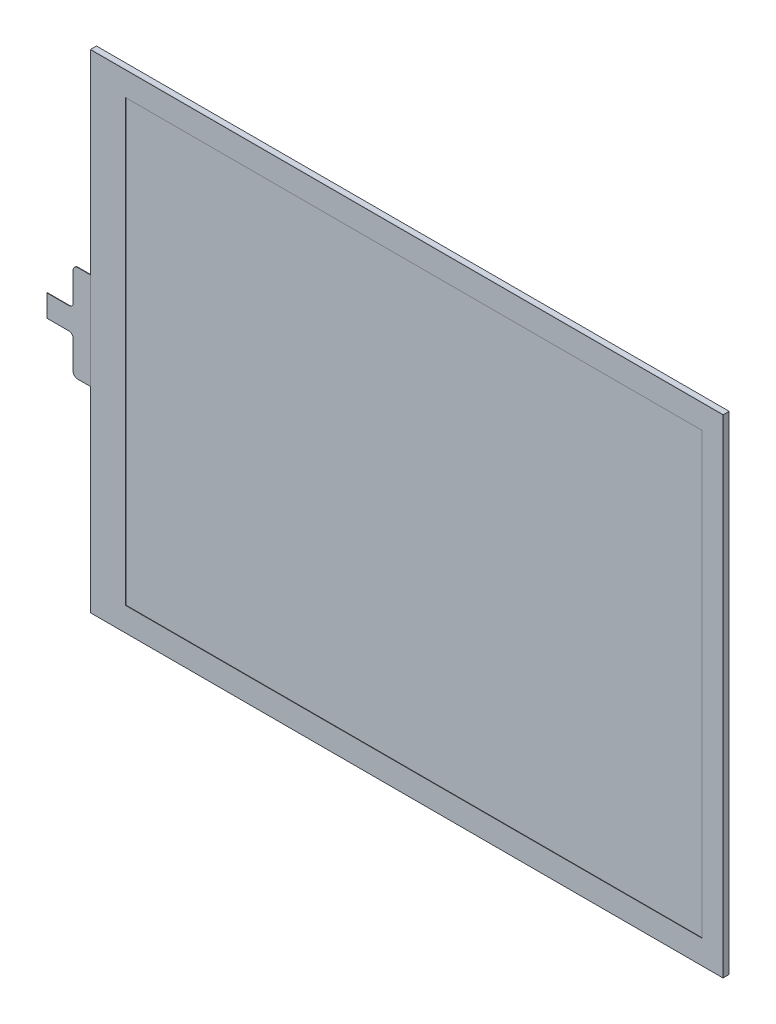
ISO-10303-21;
HEADER;
FILE_DESCRIPTION(('STEP AP214'),'2;1');
FILE_NAME('part.step','',(''),(''),'','','');
FILE_SCHEMA(('AUTOMOTIVE_DESIGN { 1 0 10303 214 1 1 1 1 }'));
ENDSEC;
DATA;
#1=APPLICATION_CONTEXT('core data for automotive mechanical design processes');
#2=APPLICATION_PROTOCOL_DEFINITION('international standard','automotive_design',2000,#1);
#3=PRODUCT_CONTEXT('',#1,'mechanical');
#4=PRODUCT('Part','Part','',(#3));
#5=PRODUCT_RELATED_PRODUCT_CATEGORY('part','',(#4));
#6=PRODUCT_DEFINITION_FORMATION('','',#4);
#7=PRODUCT_DEFINITION_CONTEXT('part definition',#1,'design');
#8=PRODUCT_DEFINITION('design','',#6,#7);
#9=PRODUCT_DEFINITION_SHAPE('','',#8);
#10=(LENGTH_UNIT() NAMED_UNIT(*) SI_UNIT(.MILLI.,.METRE.));
#11=(NAMED_UNIT(*) PLANE_ANGLE_UNIT() SI_UNIT($,.RADIAN.));
#12=(NAMED_UNIT(*) SI_UNIT($,.STERADIAN.) SOLID_ANGLE_UNIT());
#13=UNCERTAINTY_MEASURE_WITH_UNIT(LENGTH_MEASURE(1.E-05),#10,'distance_accuracy_value','');
#14=(GEOMETRIC_REPRESENTATION_CONTEXT(3) GLOBAL_UNCERTAINTY_ASSIGNED_CONTEXT((#13)) GLOBAL_UNIT_ASSIGNED_CONTEXT((#10,
#11,#12)) REPRESENTATION_CONTEXT('',''));
#15=CARTESIAN_POINT('',(0.,0.,0.));
#16=DIRECTION('',(0.,0.,1.));
#17=DIRECTION('',(1.,0.,0.));
#18=AXIS2_PLACEMENT_3D('',#15,#16,#17);
#19=CARTESIAN_POINT('',(144.,111.,1.4));
#20=DIRECTION('',(0.,0.,1.));
#21=DIRECTION('',(1.,0.,0.));
#22=AXIS2_PLACEMENT_3D('',#19,#20,#21);
#23=PLANE('',#22);
#24=DIRECTION('',(0.,1.,0.));
#25=VECTOR('',#24,1.);
#26=CARTESIAN_POINT('',(144.,0.,1.4));
#27=LINE('',#26,#25);
#28=CARTESIAN_POINT('',(144.,0.,1.4));
#29=VERTEX_POINT('',#28);
#30=CARTESIAN_POINT('',(144.,111.,1.4));
#31=VERTEX_POINT('',#30);
#32=EDGE_CURVE('E144',#29,#31,#27,.T.);
#33=ORIENTED_EDGE('',*,*,#32,.T.);
#34=DIRECTION('',(-1.,0.,0.));
#35=VECTOR('',#34,1.);
#36=CARTESIAN_POINT('',(144.,111.,1.4));
#37=LINE('',#36,#35);
#38=CARTESIAN_POINT('',(0.,111.,1.4));
#39=VERTEX_POINT('',#38);
#40=EDGE_CURVE('E147',#31,#39,#37,.T.);
#41=ORIENTED_EDGE('',*,*,#40,.T.);
#42=DIRECTION('',(0.,-1.,0.));
#43=VECTOR('',#42,1.);
#44=CARTESIAN_POINT('',(0.,111.,1.4));
#45=LINE('',#44,#43);
#46=CARTESIAN_POINT('',(0.,0.,1.4));
#47=VERTEX_POINT('',#46);
#48=EDGE_CURVE('E150',#39,#47,#45,.T.);
#49=ORIENTED_EDGE('',*,*,#48,.T.);
#50=DIRECTION('',(1.,0.,0.));
#51=VECTOR('',#50,1.);
#52=CARTESIAN_POINT('',(0.,0.,1.4));
#53=LINE('',#52,#51);
#54=EDGE_CURVE('E152',#47,#29,#53,.T.);
#55=ORIENTED_EDGE('',*,*,#54,.T.);
#56=EDGE_LOOP('',(#33,#41,#49,#55));
#57=FACE_BOUND('',#56,.T.);
#58=DIRECTION('',(-1.,0.,0.));
#59=VECTOR('',#58,1.);
#60=CARTESIAN_POINT('',(139.2,105.55,1.4));
#61=LINE('',#60,#59);
#62=CARTESIAN_POINT('',(139.2,105.55,1.4));
#63=VERTEX_POINT('',#62);
#64=CARTESIAN_POINT('',(8.00000000000001,105.55,1.4));
#65=VERTEX_POINT('',#64);
#66=EDGE_CURVE('E116',#63,#65,#61,.T.);
#67=ORIENTED_EDGE('',*,*,#66,.F.);
#68=DIRECTION('',(0.,1.,0.));
#69=VECTOR('',#68,1.);
#70=CARTESIAN_POINT('',(139.2,5.45000000000001,1.4));
#71=LINE('',#70,#69);
#72=CARTESIAN_POINT('',(139.2,5.45000000000001,1.4));
#73=VERTEX_POINT('',#72);
#74=EDGE_CURVE('E108',#73,#63,#71,.T.);
#75=ORIENTED_EDGE('',*,*,#74,.F.);
#76=DIRECTION('',(1.,0.,0.));
#77=VECTOR('',#76,1.);
#78=CARTESIAN_POINT('',(8.00000000000001,5.45,1.4));
#79=LINE('',#78,#77);
#80=CARTESIAN_POINT('',(8.00000000000001,5.45,1.4));
#81=VERTEX_POINT('',#80);
#82=EDGE_CURVE('E130',#81,#73,#79,.T.);
#83=ORIENTED_EDGE('',*,*,#82,.F.);
#84=DIRECTION('',(0.,-1.,0.));
#85=VECTOR('',#84,1.);
#86=CARTESIAN_POINT('',(8.00000000000001,105.55,1.4));
#87=LINE('',#86,#85);
#88=EDGE_CURVE('E128',#65,#81,#87,.T.);
#89=ORIENTED_EDGE('',*,*,#88,.F.);
#90=EDGE_LOOP('',(#67,#75,#83,#89));
#91=FACE_BOUND('',#90,.T.);
#92=ADVANCED_FACE('F43',(#57,#91),#23,.T.);
#93=CARTESIAN_POINT('',(144.,111.,1.3));
#94=DIRECTION('',(0.,0.,1.));
#95=DIRECTION('',(1.,0.,0.));
#96=AXIS2_PLACEMENT_3D('',#93,#94,#95);
#97=PLANE('',#96);
#98=DIRECTION('',(0.,1.,0.));
#99=VECTOR('',#98,1.);
#100=CARTESIAN_POINT('',(144.,0.,1.3));
#101=LINE('',#100,#99);
#102=CARTESIAN_POINT('',(144.,0.,1.3));
#103=VERTEX_POINT('',#102);
#104=CARTESIAN_POINT('',(144.,111.,1.3));
#105=VERTEX_POINT('',#104);
#106=EDGE_CURVE('E124',#103,#105,#101,.T.);
#107=ORIENTED_EDGE('',*,*,#106,.F.);
#108=DIRECTION('',(1.,0.,0.));
#109=VECTOR('',#108,1.);
#110=CARTESIAN_POINT('',(0.,0.,1.3));
#111=LINE('',#110,#109);
#112=CARTESIAN_POINT('',(0.,0.,1.3));
#113=VERTEX_POINT('',#112);
#114=EDGE_CURVE('E148',#113,#103,#111,.T.);
#115=ORIENTED_EDGE('',*,*,#114,.F.);
#116=DIRECTION('',(0.,-1.,0.));
#117=VECTOR('',#116,1.);
#118=CARTESIAN_POINT('',(0.,44.5,1.3));
#119=LINE('',#118,#117);
#120=CARTESIAN_POINT('',(0.,111.,1.3));
#121=VERTEX_POINT('',#120);
#122=EDGE_CURVE('E160',#121,#113,#119,.T.);
#123=ORIENTED_EDGE('',*,*,#122,.F.);
#124=DIRECTION('',(-1.,0.,0.));
#125=VECTOR('',#124,1.);
#126=CARTESIAN_POINT('',(144.,111.,1.3));
#127=LINE('',#126,#125);
#128=EDGE_CURVE('E157',#105,#121,#127,.T.);
#129=ORIENTED_EDGE('',*,*,#128,.F.);
#130=EDGE_LOOP('',(#107,#115,#123,#129));
#131=FACE_BOUND('',#130,.T.);
#132=DIRECTION('',(0.,1.,0.));
#133=VECTOR('',#132,1.);
#134=CARTESIAN_POINT('',(139.2,5.45000000000001,1.3));
#135=LINE('',#134,#133);
#136=CARTESIAN_POINT('',(139.2,5.45000000000001,1.3));
#137=VERTEX_POINT('',#136);
#138=CARTESIAN_POINT('',(139.2,105.55,1.3));
#139=VERTEX_POINT('',#138);
#140=EDGE_CURVE('E66',#137,#139,#135,.T.);
#141=ORIENTED_EDGE('',*,*,#140,.T.);
#142=DIRECTION('',(-1.,0.,0.));
#143=VECTOR('',#142,1.);
#144=CARTESIAN_POINT('',(139.2,105.55,1.3));
#145=LINE('',#144,#143);
#146=CARTESIAN_POINT('',(8.00000000000001,105.55,1.3));
#147=VERTEX_POINT('',#146);
#148=EDGE_CURVE('E123',#139,#147,#145,.T.);
#149=ORIENTED_EDGE('',*,*,#148,.T.);
#150=DIRECTION('',(0.,-1.,0.));
#151=VECTOR('',#150,1.);
#152=CARTESIAN_POINT('',(8.00000000000001,105.55,1.3));
#153=LINE('',#152,#151);
#154=CARTESIAN_POINT('',(8.00000000000001,5.45,1.3));
#155=VERTEX_POINT('',#154);
#156=EDGE_CURVE('E136',#147,#155,#153,.T.);
#157=ORIENTED_EDGE('',*,*,#156,.T.);
#158=DIRECTION('',(1.,0.,0.));
#159=VECTOR('',#158,1.);
#160=CARTESIAN_POINT('',(8.00000000000001,5.45,1.3));
#161=LINE('',#160,#159);
#162=EDGE_CURVE('E117',#155,#137,#161,.T.);
#163=ORIENTED_EDGE('',*,*,#162,.T.);
#164=EDGE_LOOP('',(#141,#149,#157,#163));
#165=FACE_BOUND('',#164,.T.);
#166=ADVANCED_FACE('F178',(#131,#165),#97,.F.);
#167=CARTESIAN_POINT('',(144.,0.,1.4));
#168=DIRECTION('',(-1.,0.,0.));
#169=DIRECTION('',(0.,0.,1.));
#170=AXIS2_PLACEMENT_3D('',#167,#168,#169);
#171=PLANE('',#170);
#172=ORIENTED_EDGE('',*,*,#106,.T.);
#173=DIRECTION('',(0.,0.,-1.));
#174=VECTOR('',#173,1.);
#175=CARTESIAN_POINT('',(144.,111.,1.4));
#176=LINE('',#175,#174);
#177=EDGE_CURVE('E12',#31,#105,#176,.T.);
#178=ORIENTED_EDGE('',*,*,#177,.F.);
#179=ORIENTED_EDGE('',*,*,#32,.F.);
#180=DIRECTION('',(0.,0.,-1.));
#181=VECTOR('',#180,1.);
#182=CARTESIAN_POINT('',(144.,0.,1.4));
#183=LINE('',#182,#181);
#184=EDGE_CURVE('E154',#29,#103,#183,.T.);
#185=ORIENTED_EDGE('',*,*,#184,.T.);
#186=EDGE_LOOP('',(#172,#178,#179,#185));
#187=FACE_BOUND('',#186,.T.);
#188=ADVANCED_FACE('F45',(#187),#171,.F.);
#189=CARTESIAN_POINT('',(144.,111.,1.4));
#190=DIRECTION('',(0.,-1.,0.));
#191=DIRECTION('',(0.,0.,-1.));
#192=AXIS2_PLACEMENT_3D('',#189,#190,#191);
#193=PLANE('',#192);
#194=ORIENTED_EDGE('',*,*,#128,.T.);
#195=DIRECTION('',(0.,0.,-1.));
#196=VECTOR('',#195,1.);
#197=CARTESIAN_POINT('',(0.,111.,1.4));
#198=LINE('',#197,#196);
#199=EDGE_CURVE('E51',#39,#121,#198,.T.);
#200=ORIENTED_EDGE('',*,*,#199,.F.);
#201=ORIENTED_EDGE('',*,*,#40,.F.);
#202=ORIENTED_EDGE('',*,*,#177,.T.);
#203=EDGE_LOOP('',(#194,#200,#201,#202));
#204=FACE_BOUND('',#203,.T.);
#205=ADVANCED_FACE('F174',(#204),#193,.F.);
#206=CARTESIAN_POINT('',(0.,44.5,1.4));
#207=DIRECTION('',(1.,0.,0.));
#208=DIRECTION('',(0.,0.,-1.));
#209=AXIS2_PLACEMENT_3D('',#206,#207,#208);
#210=PLANE('',#209);
#211=ORIENTED_EDGE('',*,*,#122,.T.);
#212=DIRECTION('',(0.,0.,-1.));
#213=VECTOR('',#212,1.);
#214=CARTESIAN_POINT('',(0.,0.,1.4));
#215=LINE('',#214,#213);
#216=EDGE_CURVE('E165',#47,#113,#215,.T.);
#217=ORIENTED_EDGE('',*,*,#216,.F.);
#218=ORIENTED_EDGE('',*,*,#48,.F.);
#219=ORIENTED_EDGE('',*,*,#199,.T.);
#220=EDGE_LOOP('',(#211,#217,#218,#219));
#221=FACE_BOUND('',#220,.T.);
#222=ADVANCED_FACE('F171',(#221),#210,.F.);
#223=CARTESIAN_POINT('',(0.,0.,1.4));
#224=DIRECTION('',(0.,1.,0.));
#225=DIRECTION('',(0.,0.,1.));
#226=AXIS2_PLACEMENT_3D('',#223,#224,#225);
#227=PLANE('',#226);
#228=ORIENTED_EDGE('',*,*,#114,.T.);
#229=ORIENTED_EDGE('',*,*,#184,.F.);
#230=ORIENTED_EDGE('',*,*,#54,.F.);
#231=ORIENTED_EDGE('',*,*,#216,.T.);
#232=EDGE_LOOP('',(#228,#229,#230,#231));
#233=FACE_BOUND('',#232,.T.);
#234=ADVANCED_FACE('F183',(#233),#227,.F.);
#235=CARTESIAN_POINT('',(139.2,5.45000000000001,1.4));
#236=DIRECTION('',(-1.,0.,0.));
#237=DIRECTION('',(0.,0.,1.));
#238=AXIS2_PLACEMENT_3D('',#235,#236,#237);
#239=PLANE('',#238);
#240=ORIENTED_EDGE('',*,*,#140,.F.);
#241=DIRECTION('',(0.,0.,-1.));
#242=VECTOR('',#241,1.);
#243=CARTESIAN_POINT('',(139.2,5.45000000000001,1.4));
#244=LINE('',#243,#242);
#245=EDGE_CURVE('E112',#73,#137,#244,.T.);
#246=ORIENTED_EDGE('',*,*,#245,.F.);
#247=ORIENTED_EDGE('',*,*,#74,.T.);
#248=DIRECTION('',(0.,0.,-1.));
#249=VECTOR('',#248,1.);
#250=CARTESIAN_POINT('',(139.2,105.55,1.4));
#251=LINE('',#250,#249);
#252=EDGE_CURVE('E111',#63,#139,#251,.T.);
#253=ORIENTED_EDGE('',*,*,#252,.T.);
#254=EDGE_LOOP('',(#240,#246,#247,#253));
#255=FACE_BOUND('',#254,.T.);
#256=ADVANCED_FACE('F110',(#255),#239,.T.);
#257=CARTESIAN_POINT('',(139.2,105.55,1.4));
#258=DIRECTION('',(0.,-1.,0.));
#259=DIRECTION('',(1.,0.,0.));
#260=AXIS2_PLACEMENT_3D('',#257,#258,#259);
#261=PLANE('',#260);
#262=ORIENTED_EDGE('',*,*,#148,.F.);
#263=ORIENTED_EDGE('',*,*,#252,.F.);
#264=ORIENTED_EDGE('',*,*,#66,.T.);
#265=DIRECTION('',(0.,0.,-1.));
#266=VECTOR('',#265,1.);
#267=CARTESIAN_POINT('',(8.00000000000001,105.55,1.4));
#268=LINE('',#267,#266);
#269=EDGE_CURVE('E125',#65,#147,#268,.T.);
#270=ORIENTED_EDGE('',*,*,#269,.T.);
#271=EDGE_LOOP('',(#262,#263,#264,#270));
#272=FACE_BOUND('',#271,.T.);
#273=ADVANCED_FACE('F120',(#272),#261,.T.);
#274=CARTESIAN_POINT('',(8.00000000000001,105.55,1.4));
#275=DIRECTION('',(1.,0.,0.));
#276=DIRECTION('',(0.,1.,0.));
#277=AXIS2_PLACEMENT_3D('',#274,#275,#276);
#278=PLANE('',#277);
#279=ORIENTED_EDGE('',*,*,#156,.F.);
#280=ORIENTED_EDGE('',*,*,#269,.F.);
#281=ORIENTED_EDGE('',*,*,#88,.T.);
#282=DIRECTION('',(0.,0.,-1.));
#283=VECTOR('',#282,1.);
#284=CARTESIAN_POINT('',(8.00000000000001,5.45,1.4));
#285=LINE('',#284,#283);
#286=EDGE_CURVE('E58',#81,#155,#285,.T.);
#287=ORIENTED_EDGE('',*,*,#286,.T.);
#288=EDGE_LOOP('',(#279,#280,#281,#287));
#289=FACE_BOUND('',#288,.T.);
#290=ADVANCED_FACE('F252',(#289),#278,.T.);
#291=CARTESIAN_POINT('',(8.00000000000001,5.45,1.4));
#292=DIRECTION('',(0.,1.,0.));
#293=DIRECTION('',(-1.,0.,0.));
#294=AXIS2_PLACEMENT_3D('',#291,#292,#293);
#295=PLANE('',#294);
#296=ORIENTED_EDGE('',*,*,#162,.F.);
#297=ORIENTED_EDGE('',*,*,#286,.F.);
#298=ORIENTED_EDGE('',*,*,#82,.T.);
#299=ORIENTED_EDGE('',*,*,#245,.T.);
#300=EDGE_LOOP('',(#296,#297,#298,#299));
#301=FACE_BOUND('',#300,.T.);
#302=ADVANCED_FACE('F259',(#301),#295,.T.);
#303=CLOSED_SHELL('',(#92,#166,#188,#205,#222,#234,#256,#273,#290,#302));
#304=MANIFOLD_SOLID_BREP('B2',#303);
#305=CARTESIAN_POINT('',(0.,0.,1.3));
#306=DIRECTION('',(1.,0.,0.));
#307=DIRECTION('',(0.,0.,-1.));
#308=AXIS2_PLACEMENT_3D('',#305,#306,#307);
#309=PLANE('',#308);
#310=DIRECTION('',(0.,0.,1.));
#311=VECTOR('',#310,1.);
#312=CARTESIAN_POINT('',(0.,44.5,1.2));
#313=LINE('',#312,#311);
#314=CARTESIAN_POINT('',(0.,44.5,1.2));
#315=VERTEX_POINT('',#314);
#316=CARTESIAN_POINT('',(0.,44.5,1.3));
#317=VERTEX_POINT('',#316);
#318=EDGE_CURVE('E422',#315,#317,#313,.T.);
#319=ORIENTED_EDGE('',*,*,#318,.F.);
#320=DIRECTION('',(0.,1.,0.));
#321=VECTOR('',#320,1.);
#322=CARTESIAN_POINT('',(0.,66.5,1.2));
#323=LINE('',#322,#321);
#324=CARTESIAN_POINT('',(0.,66.5,1.2));
#325=VERTEX_POINT('',#324);
#326=EDGE_CURVE('E415',#315,#325,#323,.T.);
#327=ORIENTED_EDGE('',*,*,#326,.T.);
#328=DIRECTION('',(0.,0.,1.));
#329=VECTOR('',#328,1.);
#330=CARTESIAN_POINT('',(0.,66.5,1.2));
#331=LINE('',#330,#329);
#332=CARTESIAN_POINT('',(0.,66.5,1.3));
#333=VERTEX_POINT('',#332);
#334=EDGE_CURVE('E401',#325,#333,#331,.T.);
#335=ORIENTED_EDGE('',*,*,#334,.T.);
#336=DIRECTION('',(0.,-1.,0.));
#337=VECTOR('',#336,1.);
#338=CARTESIAN_POINT('',(0.,0.,1.3));
#339=LINE('',#338,#337);
#340=CARTESIAN_POINT('',(0.,111.,1.3));
#341=VERTEX_POINT('',#340);
#342=EDGE_CURVE('E529',#341,#333,#339,.T.);
#343=ORIENTED_EDGE('',*,*,#342,.F.);
#344=DIRECTION('',(0.,0.,-1.));
#345=VECTOR('',#344,1.);
#346=CARTESIAN_POINT('',(0.,111.,1.3));
#347=LINE('',#346,#345);
#348=CARTESIAN_POINT('',(0.,111.,0.));
#349=VERTEX_POINT('',#348);
#350=EDGE_CURVE('E523',#341,#349,#347,.T.);
#351=ORIENTED_EDGE('',*,*,#350,.T.);
#352=DIRECTION('',(0.,-1.,0.));
#353=VECTOR('',#352,1.);
#354=CARTESIAN_POINT('',(0.,0.,0.));
#355=LINE('',#354,#353);
#356=CARTESIAN_POINT('',(0.,0.,0.));
#357=VERTEX_POINT('',#356);
#358=EDGE_CURVE('E507',#349,#357,#355,.T.);
#359=ORIENTED_EDGE('',*,*,#358,.T.);
#360=DIRECTION('',(0.,0.,-1.));
#361=VECTOR('',#360,1.);
#362=CARTESIAN_POINT('',(0.,0.,1.3));
#363=LINE('',#362,#361);
#364=CARTESIAN_POINT('',(0.,0.,1.3));
#365=VERTEX_POINT('',#364);
#366=EDGE_CURVE('E41',#365,#357,#363,.T.);
#367=ORIENTED_EDGE('',*,*,#366,.F.);
#368=EDGE_CURVE('E332',#317,#365,#339,.T.);
#369=ORIENTED_EDGE('',*,*,#368,.F.);
#370=EDGE_LOOP('',(#319,#327,#335,#343,#351,#359,#367,#369));
#371=FACE_BOUND('',#370,.T.);
#372=ADVANCED_FACE('F279',(#371),#309,.F.);
#373=CARTESIAN_POINT('',(0.,0.,1.3));
#374=DIRECTION('',(0.,1.,0.));
#375=DIRECTION('',(0.,0.,1.));
#376=AXIS2_PLACEMENT_3D('',#373,#374,#375);
#377=PLANE('',#376);
#378=DIRECTION('',(1.,0.,0.));
#379=VECTOR('',#378,1.);
#380=CARTESIAN_POINT('',(0.,0.,0.));
#381=LINE('',#380,#379);
#382=CARTESIAN_POINT('',(144.,0.,0.));
#383=VERTEX_POINT('',#382);
#384=EDGE_CURVE('E512',#357,#383,#381,.T.);
#385=ORIENTED_EDGE('',*,*,#384,.T.);
#386=DIRECTION('',(0.,0.,-1.));
#387=VECTOR('',#386,1.);
#388=CARTESIAN_POINT('',(144.,0.,1.3));
#389=LINE('',#388,#387);
#390=CARTESIAN_POINT('',(144.,0.,1.3));
#391=VERTEX_POINT('',#390);
#392=EDGE_CURVE('E287',#391,#383,#389,.T.);
#393=ORIENTED_EDGE('',*,*,#392,.F.);
#394=DIRECTION('',(1.,0.,0.));
#395=VECTOR('',#394,1.);
#396=CARTESIAN_POINT('',(0.,0.,1.3));
#397=LINE('',#396,#395);
#398=EDGE_CURVE('E531',#365,#391,#397,.T.);
#399=ORIENTED_EDGE('',*,*,#398,.F.);
#400=ORIENTED_EDGE('',*,*,#366,.T.);
#401=EDGE_LOOP('',(#385,#393,#399,#400));
#402=FACE_BOUND('',#401,.T.);
#403=ADVANCED_FACE('F539',(#402),#377,.F.);
#404=CARTESIAN_POINT('',(144.,0.,1.3));
#405=DIRECTION('',(-1.,0.,0.));
#406=DIRECTION('',(0.,0.,1.));
#407=AXIS2_PLACEMENT_3D('',#404,#405,#406);
#408=PLANE('',#407);
#409=DIRECTION('',(0.,1.,0.));
#410=VECTOR('',#409,1.);
#411=CARTESIAN_POINT('',(144.,0.,0.));
#412=LINE('',#411,#410);
#413=CARTESIAN_POINT('',(144.,111.,0.));
#414=VERTEX_POINT('',#413);
#415=EDGE_CURVE('E516',#383,#414,#412,.T.);
#416=ORIENTED_EDGE('',*,*,#415,.T.);
#417=DIRECTION('',(0.,0.,-1.));
#418=VECTOR('',#417,1.);
#419=CARTESIAN_POINT('',(144.,111.,1.3));
#420=LINE('',#419,#418);
#421=CARTESIAN_POINT('',(144.,111.,1.3));
#422=VERTEX_POINT('',#421);
#423=EDGE_CURVE('E525',#422,#414,#420,.T.);
#424=ORIENTED_EDGE('',*,*,#423,.F.);
#425=DIRECTION('',(0.,1.,0.));
#426=VECTOR('',#425,1.);
#427=CARTESIAN_POINT('',(144.,0.,1.3));
#428=LINE('',#427,#426);
#429=EDGE_CURVE('E541',#391,#422,#428,.T.);
#430=ORIENTED_EDGE('',*,*,#429,.F.);
#431=ORIENTED_EDGE('',*,*,#392,.T.);
#432=EDGE_LOOP('',(#416,#424,#430,#431));
#433=FACE_BOUND('',#432,.T.);
#434=ADVANCED_FACE('F544',(#433),#408,.F.);
#435=CARTESIAN_POINT('',(0.,111.,1.3));
#436=DIRECTION('',(0.,-1.,0.));
#437=DIRECTION('',(0.,0.,-1.));
#438=AXIS2_PLACEMENT_3D('',#435,#436,#437);
#439=PLANE('',#438);
#440=DIRECTION('',(-1.,0.,0.));
#441=VECTOR('',#440,1.);
#442=CARTESIAN_POINT('',(0.,111.,0.));
#443=LINE('',#442,#441);
#444=EDGE_CURVE('E325',#414,#349,#443,.T.);
#445=ORIENTED_EDGE('',*,*,#444,.T.);
#446=ORIENTED_EDGE('',*,*,#350,.F.);
#447=DIRECTION('',(-1.,0.,0.));
#448=VECTOR('',#447,1.);
#449=CARTESIAN_POINT('',(0.,111.,1.3));
#450=LINE('',#449,#448);
#451=EDGE_CURVE('E304',#422,#341,#450,.T.);
#452=ORIENTED_EDGE('',*,*,#451,.F.);
#453=ORIENTED_EDGE('',*,*,#423,.T.);
#454=EDGE_LOOP('',(#445,#446,#452,#453));
#455=FACE_BOUND('',#454,.T.);
#456=ADVANCED_FACE('F545',(#455),#439,.F.);
#457=CARTESIAN_POINT('',(0.,111.,1.3));
#458=DIRECTION('',(0.,0.,-1.));
#459=DIRECTION('',(-1.,0.,0.));
#460=AXIS2_PLACEMENT_3D('',#457,#458,#459);
#461=PLANE('',#460);
#462=ORIENTED_EDGE('',*,*,#342,.T.);
#463=DIRECTION('',(-1.,0.,0.));
#464=VECTOR('',#463,1.);
#465=CARTESIAN_POINT('',(0.,66.5,1.3));
#466=LINE('',#465,#464);
#467=CARTESIAN_POINT('',(-3.,66.5000000000001,1.3));
#468=VERTEX_POINT('',#467);
#469=EDGE_CURVE('E295',#333,#468,#466,.T.);
#470=ORIENTED_EDGE('',*,*,#469,.T.);
#471=CARTESIAN_POINT('',(-3.,65.5000000000001,1.3));
#472=DIRECTION('',(0.,0.,1.));
#473=DIRECTION('',(-1.,0.,0.));
#474=AXIS2_PLACEMENT_3D('',#471,#472,#473);
#475=CIRCLE('',#474,1.);
#476=CARTESIAN_POINT('',(-4.,65.5000000000001,1.3));
#477=VERTEX_POINT('',#476);
#478=EDGE_CURVE('E453',#468,#477,#475,.T.);
#479=ORIENTED_EDGE('',*,*,#478,.T.);
#480=DIRECTION('',(0.,-1.,0.));
#481=VECTOR('',#480,1.);
#482=CARTESIAN_POINT('',(-3.99999999999999,65.5000000000001,1.3));
#483=LINE('',#482,#481);
#484=CARTESIAN_POINT('',(-4.,59.0000000000001,1.3));
#485=VERTEX_POINT('',#484);
#486=EDGE_CURVE('E456',#477,#485,#483,.T.);
#487=ORIENTED_EDGE('',*,*,#486,.T.);
#488=CARTESIAN_POINT('',(-5.,59.0000000000001,1.3));
#489=DIRECTION('',(0.,0.,-1.));
#490=DIRECTION('',(1.,0.,0.));
#491=AXIS2_PLACEMENT_3D('',#488,#489,#490);
#492=CIRCLE('',#491,1.);
#493=CARTESIAN_POINT('',(-5.,58.0000000000001,1.3));
#494=VERTEX_POINT('',#493);
#495=EDGE_CURVE('E459',#485,#494,#492,.T.);
#496=ORIENTED_EDGE('',*,*,#495,.T.);
#497=DIRECTION('',(-1.,0.,0.));
#498=VECTOR('',#497,1.);
#499=CARTESIAN_POINT('',(-5.,58.0000000000001,1.3));
#500=LINE('',#499,#498);
#501=CARTESIAN_POINT('',(-10.,58.,1.3));
#502=VERTEX_POINT('',#501);
#503=EDGE_CURVE('E462',#494,#502,#500,.T.);
#504=ORIENTED_EDGE('',*,*,#503,.T.);
#505=DIRECTION('',(0.,-1.,0.));
#506=VECTOR('',#505,1.);
#507=CARTESIAN_POINT('',(-10.,58.,1.3));
#508=LINE('',#507,#506);
#509=CARTESIAN_POINT('',(-10.,53.,1.3));
#510=VERTEX_POINT('',#509);
#511=EDGE_CURVE('E465',#502,#510,#508,.T.);
#512=ORIENTED_EDGE('',*,*,#511,.T.);
#513=DIRECTION('',(1.,0.,0.));
#514=VECTOR('',#513,1.);
#515=CARTESIAN_POINT('',(-10.,53.,1.3));
#516=LINE('',#515,#514);
#517=CARTESIAN_POINT('',(-5.,53.0000000000001,1.3));
#518=VERTEX_POINT('',#517);
#519=EDGE_CURVE('E468',#510,#518,#516,.T.);
#520=ORIENTED_EDGE('',*,*,#519,.T.);
#521=CARTESIAN_POINT('',(-5.,52.0000000000001,1.3));
#522=DIRECTION('',(0.,0.,-1.));
#523=DIRECTION('',(1.,0.,0.));
#524=AXIS2_PLACEMENT_3D('',#521,#522,#523);
#525=CIRCLE('',#524,1.);
#526=CARTESIAN_POINT('',(-3.99999999999999,52.0000000000001,1.3));
#527=VERTEX_POINT('',#526);
#528=EDGE_CURVE('E471',#518,#527,#525,.T.);
#529=ORIENTED_EDGE('',*,*,#528,.T.);
#530=DIRECTION('',(0.,-1.,0.));
#531=VECTOR('',#530,1.);
#532=CARTESIAN_POINT('',(-4.,52.0000000000001,1.3));
#533=LINE('',#532,#531);
#534=CARTESIAN_POINT('',(-3.99999999999999,45.5000000000001,1.3));
#535=VERTEX_POINT('',#534);
#536=EDGE_CURVE('E474',#527,#535,#533,.T.);
#537=ORIENTED_EDGE('',*,*,#536,.T.);
#538=CARTESIAN_POINT('',(-3.,45.5000000000001,1.3));
#539=DIRECTION('',(0.,0.,1.));
#540=DIRECTION('',(-1.,0.,0.));
#541=AXIS2_PLACEMENT_3D('',#538,#539,#540);
#542=CIRCLE('',#541,1.);
#543=CARTESIAN_POINT('',(-3.,44.5000000000001,1.3));
#544=VERTEX_POINT('',#543);
#545=EDGE_CURVE('E425',#535,#544,#542,.T.);
#546=ORIENTED_EDGE('',*,*,#545,.T.);
#547=DIRECTION('',(1.,0.,0.));
#548=VECTOR('',#547,1.);
#549=CARTESIAN_POINT('',(0.,44.5,1.3));
#550=LINE('',#549,#548);
#551=EDGE_CURVE('E423',#544,#317,#550,.T.);
#552=ORIENTED_EDGE('',*,*,#551,.T.);
#553=ORIENTED_EDGE('',*,*,#368,.T.);
#554=ORIENTED_EDGE('',*,*,#398,.T.);
#555=ORIENTED_EDGE('',*,*,#429,.T.);
#556=ORIENTED_EDGE('',*,*,#451,.T.);
#557=EDGE_LOOP('',(#462,#470,#479,#487,#496,#504,#512,#520,#529,#537,#546,#552,#553,#554,#555,#556));
#558=FACE_BOUND('',#557,.T.);
#559=ADVANCED_FACE('F532',(#558),#461,.F.);
#560=CARTESIAN_POINT('',(0.,111.,0.));
#561=DIRECTION('',(0.,0.,-1.));
#562=DIRECTION('',(-1.,0.,0.));
#563=AXIS2_PLACEMENT_3D('',#560,#561,#562);
#564=PLANE('',#563);
#565=ORIENTED_EDGE('',*,*,#358,.F.);
#566=ORIENTED_EDGE('',*,*,#444,.F.);
#567=ORIENTED_EDGE('',*,*,#415,.F.);
#568=ORIENTED_EDGE('',*,*,#384,.F.);
#569=EDGE_LOOP('',(#565,#566,#567,#568));
#570=FACE_BOUND('',#569,.T.);
#571=ADVANCED_FACE('F535',(#570),#564,.T.);
#572=CARTESIAN_POINT('',(0.,44.5,1.2));
#573=DIRECTION('',(0.,-1.,0.));
#574=DIRECTION('',(1.,0.,0.));
#575=AXIS2_PLACEMENT_3D('',#572,#573,#574);
#576=PLANE('',#575);
#577=ORIENTED_EDGE('',*,*,#551,.F.);
#578=DIRECTION('',(0.,0.,1.));
#579=VECTOR('',#578,1.);
#580=CARTESIAN_POINT('',(-3.,44.5000000000001,1.2));
#581=LINE('',#580,#579);
#582=CARTESIAN_POINT('',(-3.,44.5000000000001,1.2));
#583=VERTEX_POINT('',#582);
#584=EDGE_CURVE('E479',#583,#544,#581,.T.);
#585=ORIENTED_EDGE('',*,*,#584,.F.);
#586=DIRECTION('',(1.,0.,0.));
#587=VECTOR('',#586,1.);
#588=CARTESIAN_POINT('',(0.,44.5,1.2));
#589=LINE('',#588,#587);
#590=EDGE_CURVE('E409',#583,#315,#589,.T.);
#591=ORIENTED_EDGE('',*,*,#590,.T.);
#592=ORIENTED_EDGE('',*,*,#318,.T.);
#593=EDGE_LOOP('',(#577,#585,#591,#592));
#594=FACE_BOUND('',#593,.T.);
#595=ADVANCED_FACE('F578',(#594),#576,.T.);
#596=CARTESIAN_POINT('',(-3.,45.5000000000001,1.2));
#597=DIRECTION('',(0.,0.,1.));
#598=DIRECTION('',(1.,0.,0.));
#599=AXIS2_PLACEMENT_3D('',#596,#597,#598);
#600=CYLINDRICAL_SURFACE('',#599,1.);
#601=ORIENTED_EDGE('',*,*,#545,.F.);
#602=DIRECTION('',(0.,0.,1.));
#603=VECTOR('',#602,1.);
#604=CARTESIAN_POINT('',(-3.99999999999999,45.5000000000001,1.2));
#605=LINE('',#604,#603);
#606=CARTESIAN_POINT('',(-3.99999999999999,45.5000000000001,1.2));
#607=VERTEX_POINT('',#606);
#608=EDGE_CURVE('E481',#607,#535,#605,.T.);
#609=ORIENTED_EDGE('',*,*,#608,.F.);
#610=CARTESIAN_POINT('',(-3.,45.5000000000001,1.2));
#611=DIRECTION('',(0.,0.,1.));
#612=DIRECTION('',(-1.,0.,0.));
#613=AXIS2_PLACEMENT_3D('',#610,#611,#612);
#614=CIRCLE('',#613,1.);
#615=EDGE_CURVE('E449',#607,#583,#614,.T.);
#616=ORIENTED_EDGE('',*,*,#615,.T.);
#617=ORIENTED_EDGE('',*,*,#584,.T.);
#618=EDGE_LOOP('',(#601,#609,#616,#617));
#619=FACE_BOUND('',#618,.T.);
#620=ADVANCED_FACE('F597',(#619),#600,.T.);
#621=CARTESIAN_POINT('',(-4.,52.0000000000001,1.2));
#622=DIRECTION('',(-1.,0.,0.));
#623=DIRECTION('',(0.,-1.,0.));
#624=AXIS2_PLACEMENT_3D('',#621,#622,#623);
#625=PLANE('',#624);
#626=ORIENTED_EDGE('',*,*,#536,.F.);
#627=DIRECTION('',(0.,0.,1.));
#628=VECTOR('',#627,1.);
#629=CARTESIAN_POINT('',(-3.99999999999999,52.0000000000001,1.2));
#630=LINE('',#629,#628);
#631=CARTESIAN_POINT('',(-3.99999999999999,52.0000000000001,1.2));
#632=VERTEX_POINT('',#631);
#633=EDGE_CURVE('E483',#632,#527,#630,.T.);
#634=ORIENTED_EDGE('',*,*,#633,.F.);
#635=DIRECTION('',(0.,-1.,0.));
#636=VECTOR('',#635,1.);
#637=CARTESIAN_POINT('',(-4.,52.0000000000001,1.2));
#638=LINE('',#637,#636);
#639=EDGE_CURVE('E446',#632,#607,#638,.T.);
#640=ORIENTED_EDGE('',*,*,#639,.T.);
#641=ORIENTED_EDGE('',*,*,#608,.T.);
#642=EDGE_LOOP('',(#626,#634,#640,#641));
#643=FACE_BOUND('',#642,.T.);
#644=ADVANCED_FACE('F606',(#643),#625,.T.);
#645=CARTESIAN_POINT('',(-5.,52.0000000000001,1.2));
#646=DIRECTION('',(0.,0.,1.));
#647=DIRECTION('',(1.,0.,0.));
#648=AXIS2_PLACEMENT_3D('',#645,#646,#647);
#649=CYLINDRICAL_SURFACE('',#648,1.);
#650=ORIENTED_EDGE('',*,*,#528,.F.);
#651=DIRECTION('',(0.,0.,1.));
#652=VECTOR('',#651,1.);
#653=CARTESIAN_POINT('',(-5.,53.0000000000001,1.2));
#654=LINE('',#653,#652);
#655=CARTESIAN_POINT('',(-5.,53.0000000000001,1.2));
#656=VERTEX_POINT('',#655);
#657=EDGE_CURVE('E485',#656,#518,#654,.T.);
#658=ORIENTED_EDGE('',*,*,#657,.F.);
#659=CARTESIAN_POINT('',(-5.,52.0000000000001,1.2));
#660=DIRECTION('',(0.,0.,-1.));
#661=DIRECTION('',(1.,0.,0.));
#662=AXIS2_PLACEMENT_3D('',#659,#660,#661);
#663=CIRCLE('',#662,1.);
#664=EDGE_CURVE('E443',#656,#632,#663,.T.);
#665=ORIENTED_EDGE('',*,*,#664,.T.);
#666=ORIENTED_EDGE('',*,*,#633,.T.);
#667=EDGE_LOOP('',(#650,#658,#665,#666));
#668=FACE_BOUND('',#667,.T.);
#669=ADVANCED_FACE('F616',(#668),#649,.F.);
#670=CARTESIAN_POINT('',(-10.,53.,1.2));
#671=DIRECTION('',(0.,-1.,0.));
#672=DIRECTION('',(1.,0.,0.));
#673=AXIS2_PLACEMENT_3D('',#670,#671,#672);
#674=PLANE('',#673);
#675=ORIENTED_EDGE('',*,*,#519,.F.);
#676=DIRECTION('',(0.,0.,1.));
#677=VECTOR('',#676,1.);
#678=CARTESIAN_POINT('',(-10.,53.,1.2));
#679=LINE('',#678,#677);
#680=CARTESIAN_POINT('',(-10.,53.,1.2));
#681=VERTEX_POINT('',#680);
#682=EDGE_CURVE('E487',#681,#510,#679,.T.);
#683=ORIENTED_EDGE('',*,*,#682,.F.);
#684=DIRECTION('',(1.,0.,0.));
#685=VECTOR('',#684,1.);
#686=CARTESIAN_POINT('',(-10.,53.,1.2));
#687=LINE('',#686,#685);
#688=EDGE_CURVE('E440',#681,#656,#687,.T.);
#689=ORIENTED_EDGE('',*,*,#688,.T.);
#690=ORIENTED_EDGE('',*,*,#657,.T.);
#691=EDGE_LOOP('',(#675,#683,#689,#690));
#692=FACE_BOUND('',#691,.T.);
#693=ADVANCED_FACE('F626',(#692),#674,.T.);
#694=CARTESIAN_POINT('',(-10.,58.,1.2));
#695=DIRECTION('',(-1.,0.,0.));
#696=DIRECTION('',(0.,0.,1.));
#697=AXIS2_PLACEMENT_3D('',#694,#695,#696);
#698=PLANE('',#697);
#699=ORIENTED_EDGE('',*,*,#511,.F.);
#700=DIRECTION('',(0.,0.,1.));
#701=VECTOR('',#700,1.);
#702=CARTESIAN_POINT('',(-10.,58.,1.2));
#703=LINE('',#702,#701);
#704=CARTESIAN_POINT('',(-10.,58.,1.2));
#705=VERTEX_POINT('',#704);
#706=EDGE_CURVE('E489',#705,#502,#703,.T.);
#707=ORIENTED_EDGE('',*,*,#706,.F.);
#708=DIRECTION('',(0.,-1.,0.));
#709=VECTOR('',#708,1.);
#710=CARTESIAN_POINT('',(-10.,58.,1.2));
#711=LINE('',#710,#709);
#712=EDGE_CURVE('E437',#705,#681,#711,.T.);
#713=ORIENTED_EDGE('',*,*,#712,.T.);
#714=ORIENTED_EDGE('',*,*,#682,.T.);
#715=EDGE_LOOP('',(#699,#707,#713,#714));
#716=FACE_BOUND('',#715,.T.);
#717=ADVANCED_FACE('F636',(#716),#698,.T.);
#718=CARTESIAN_POINT('',(-5.,58.0000000000001,1.2));
#719=DIRECTION('',(0.,1.,0.));
#720=DIRECTION('',(-1.,0.,0.));
#721=AXIS2_PLACEMENT_3D('',#718,#719,#720);
#722=PLANE('',#721);
#723=ORIENTED_EDGE('',*,*,#503,.F.);
#724=DIRECTION('',(0.,0.,1.));
#725=VECTOR('',#724,1.);
#726=CARTESIAN_POINT('',(-5.,58.0000000000001,1.2));
#727=LINE('',#726,#725);
#728=CARTESIAN_POINT('',(-5.,58.0000000000001,1.2));
#729=VERTEX_POINT('',#728);
#730=EDGE_CURVE('E491',#729,#494,#727,.T.);
#731=ORIENTED_EDGE('',*,*,#730,.F.);
#732=DIRECTION('',(-1.,0.,0.));
#733=VECTOR('',#732,1.);
#734=CARTESIAN_POINT('',(-5.,58.0000000000001,1.2));
#735=LINE('',#734,#733);
#736=EDGE_CURVE('E434',#729,#705,#735,.T.);
#737=ORIENTED_EDGE('',*,*,#736,.T.);
#738=ORIENTED_EDGE('',*,*,#706,.T.);
#739=EDGE_LOOP('',(#723,#731,#737,#738));
#740=FACE_BOUND('',#739,.T.);
#741=ADVANCED_FACE('F646',(#740),#722,.T.);
#742=CARTESIAN_POINT('',(-5.,59.0000000000001,1.2));
#743=DIRECTION('',(0.,0.,1.));
#744=DIRECTION('',(1.,0.,0.));
#745=AXIS2_PLACEMENT_3D('',#742,#743,#744);
#746=CYLINDRICAL_SURFACE('',#745,1.);
#747=ORIENTED_EDGE('',*,*,#495,.F.);
#748=DIRECTION('',(0.,0.,1.));
#749=VECTOR('',#748,1.);
#750=CARTESIAN_POINT('',(-4.,59.0000000000001,1.2));
#751=LINE('',#750,#749);
#752=CARTESIAN_POINT('',(-4.,59.0000000000001,1.2));
#753=VERTEX_POINT('',#752);
#754=EDGE_CURVE('E493',#753,#485,#751,.T.);
#755=ORIENTED_EDGE('',*,*,#754,.F.);
#756=CARTESIAN_POINT('',(-5.,59.0000000000001,1.2));
#757=DIRECTION('',(0.,0.,-1.));
#758=DIRECTION('',(1.,0.,0.));
#759=AXIS2_PLACEMENT_3D('',#756,#757,#758);
#760=CIRCLE('',#759,1.);
#761=EDGE_CURVE('E431',#753,#729,#760,.T.);
#762=ORIENTED_EDGE('',*,*,#761,.T.);
#763=ORIENTED_EDGE('',*,*,#730,.T.);
#764=EDGE_LOOP('',(#747,#755,#762,#763));
#765=FACE_BOUND('',#764,.T.);
#766=ADVANCED_FACE('F656',(#765),#746,.F.);
#767=CARTESIAN_POINT('',(-3.99999999999999,65.5000000000001,1.2));
#768=DIRECTION('',(-1.,0.,0.));
#769=DIRECTION('',(0.,-1.,0.));
#770=AXIS2_PLACEMENT_3D('',#767,#768,#769);
#771=PLANE('',#770);
#772=ORIENTED_EDGE('',*,*,#486,.F.);
#773=DIRECTION('',(0.,0.,1.));
#774=VECTOR('',#773,1.);
#775=CARTESIAN_POINT('',(-4.,65.5000000000001,1.2));
#776=LINE('',#775,#774);
#777=CARTESIAN_POINT('',(-4.,65.5000000000001,1.2));
#778=VERTEX_POINT('',#777);
#779=EDGE_CURVE('E495',#778,#477,#776,.T.);
#780=ORIENTED_EDGE('',*,*,#779,.F.);
#781=DIRECTION('',(0.,-1.,0.));
#782=VECTOR('',#781,1.);
#783=CARTESIAN_POINT('',(-3.99999999999999,65.5000000000001,1.2));
#784=LINE('',#783,#782);
#785=EDGE_CURVE('E428',#778,#753,#784,.T.);
#786=ORIENTED_EDGE('',*,*,#785,.T.);
#787=ORIENTED_EDGE('',*,*,#754,.T.);
#788=EDGE_LOOP('',(#772,#780,#786,#787));
#789=FACE_BOUND('',#788,.T.);
#790=ADVANCED_FACE('F666',(#789),#771,.T.);
#791=CARTESIAN_POINT('',(-3.,65.5000000000001,1.2));
#792=DIRECTION('',(0.,0.,1.));
#793=DIRECTION('',(1.,0.,0.));
#794=AXIS2_PLACEMENT_3D('',#791,#792,#793);
#795=CYLINDRICAL_SURFACE('',#794,1.);
#796=ORIENTED_EDGE('',*,*,#478,.F.);
#797=DIRECTION('',(0.,0.,1.));
#798=VECTOR('',#797,1.);
#799=CARTESIAN_POINT('',(-3.,66.5000000000001,1.2));
#800=LINE('',#799,#798);
#801=CARTESIAN_POINT('',(-3.,66.5000000000001,1.2));
#802=VERTEX_POINT('',#801);
#803=EDGE_CURVE('E408',#802,#468,#800,.T.);
#804=ORIENTED_EDGE('',*,*,#803,.F.);
#805=CARTESIAN_POINT('',(-3.,65.5000000000001,1.2));
#806=DIRECTION('',(0.,0.,1.));
#807=DIRECTION('',(-1.,0.,0.));
#808=AXIS2_PLACEMENT_3D('',#805,#806,#807);
#809=CIRCLE('',#808,1.);
#810=EDGE_CURVE('E419',#802,#778,#809,.T.);
#811=ORIENTED_EDGE('',*,*,#810,.T.);
#812=ORIENTED_EDGE('',*,*,#779,.T.);
#813=EDGE_LOOP('',(#796,#804,#811,#812));
#814=FACE_BOUND('',#813,.T.);
#815=ADVANCED_FACE('F676',(#814),#795,.T.);
#816=CARTESIAN_POINT('',(0.,66.5,1.2));
#817=DIRECTION('',(0.,1.,0.));
#818=DIRECTION('',(-1.,0.,0.));
#819=AXIS2_PLACEMENT_3D('',#816,#817,#818);
#820=PLANE('',#819);
#821=ORIENTED_EDGE('',*,*,#469,.F.);
#822=ORIENTED_EDGE('',*,*,#334,.F.);
#823=DIRECTION('',(-1.,0.,0.));
#824=VECTOR('',#823,1.);
#825=CARTESIAN_POINT('',(0.,66.5,1.2));
#826=LINE('',#825,#824);
#827=EDGE_CURVE('E404',#325,#802,#826,.T.);
#828=ORIENTED_EDGE('',*,*,#827,.T.);
#829=ORIENTED_EDGE('',*,*,#803,.T.);
#830=EDGE_LOOP('',(#821,#822,#828,#829));
#831=FACE_BOUND('',#830,.T.);
#832=ADVANCED_FACE('F403',(#831),#820,.T.);
#833=CARTESIAN_POINT('',(-3.,45.5000000000001,1.2));
#834=DIRECTION('',(0.,0.,-1.));
#835=DIRECTION('',(-1.,0.,0.));
#836=AXIS2_PLACEMENT_3D('',#833,#834,#835);
#837=PLANE('',#836);
#838=ORIENTED_EDGE('',*,*,#326,.F.);
#839=ORIENTED_EDGE('',*,*,#590,.F.);
#840=ORIENTED_EDGE('',*,*,#615,.F.);
#841=ORIENTED_EDGE('',*,*,#639,.F.);
#842=ORIENTED_EDGE('',*,*,#664,.F.);
#843=ORIENTED_EDGE('',*,*,#688,.F.);
#844=ORIENTED_EDGE('',*,*,#712,.F.);
#845=ORIENTED_EDGE('',*,*,#736,.F.);
#846=ORIENTED_EDGE('',*,*,#761,.F.);
#847=ORIENTED_EDGE('',*,*,#785,.F.);
#848=ORIENTED_EDGE('',*,*,#810,.F.);
#849=ORIENTED_EDGE('',*,*,#827,.F.);
#850=EDGE_LOOP('',(#838,#839,#840,#841,#842,#843,#844,#845,#846,#847,#848,#849));
#851=FACE_BOUND('',#850,.T.);
#852=ADVANCED_FACE('F413',(#851),#837,.T.);
#853=CLOSED_SHELL('',(#372,#403,#434,#456,#559,#571,#595,#620,#644,#669,#693,#717,#741,#766,
#790,#815,#832,#852));
#854=MANIFOLD_SOLID_BREP('B6',#853);
#855=ADVANCED_BREP_SHAPE_REPRESENTATION('',(#18,#304,#854),#14);
#856=SHAPE_DEFINITION_REPRESENTATION(#9,#855);
ENDSEC;
END-ISO-10303-21;
